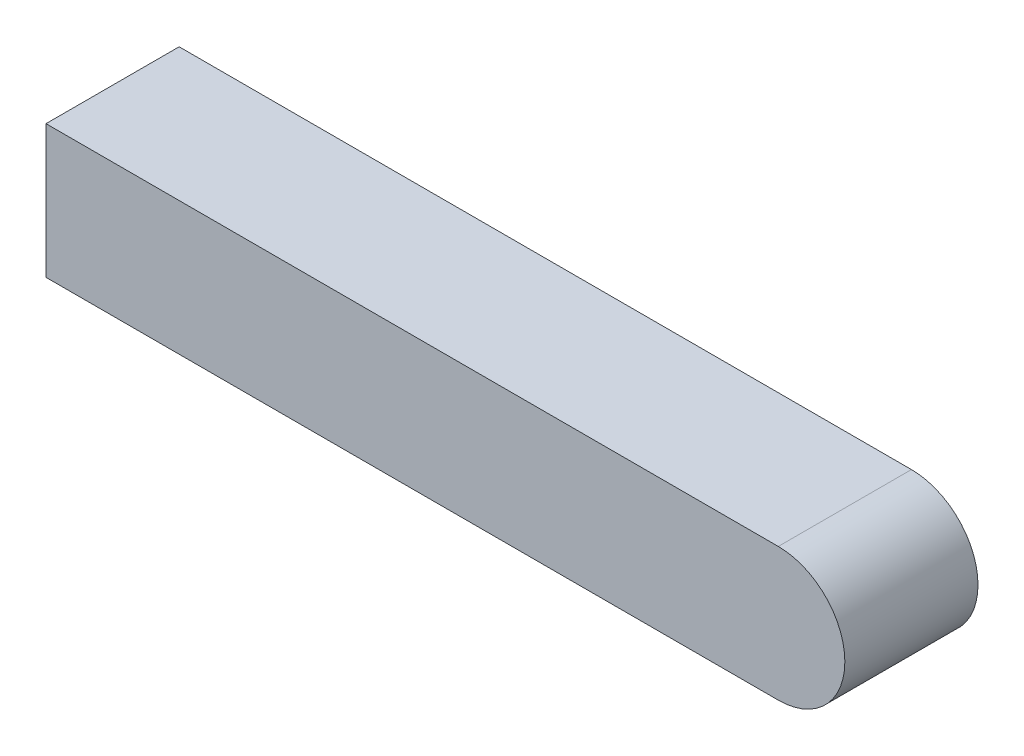
ISO-10303-21;
HEADER;
FILE_DESCRIPTION(('STEP AP214'),'2;1');
FILE_NAME('part.step','',(''),(''),'','','');
FILE_SCHEMA(('AUTOMOTIVE_DESIGN { 1 0 10303 214 1 1 1 1 }'));
ENDSEC;
DATA;
#1=APPLICATION_CONTEXT('core data for automotive mechanical design processes');
#2=APPLICATION_PROTOCOL_DEFINITION('international standard','automotive_design',2000,#1);
#3=PRODUCT_CONTEXT('',#1,'mechanical');
#4=PRODUCT('Part','Part','',(#3));
#5=PRODUCT_RELATED_PRODUCT_CATEGORY('part','',(#4));
#6=PRODUCT_DEFINITION_FORMATION('','',#4);
#7=PRODUCT_DEFINITION_CONTEXT('part definition',#1,'design');
#8=PRODUCT_DEFINITION('design','',#6,#7);
#9=PRODUCT_DEFINITION_SHAPE('','',#8);
#10=(LENGTH_UNIT() NAMED_UNIT(*) SI_UNIT(.MILLI.,.METRE.));
#11=(NAMED_UNIT(*) PLANE_ANGLE_UNIT() SI_UNIT($,.RADIAN.));
#12=(NAMED_UNIT(*) SI_UNIT($,.STERADIAN.) SOLID_ANGLE_UNIT());
#13=UNCERTAINTY_MEASURE_WITH_UNIT(LENGTH_MEASURE(1.E-05),#10,'distance_accuracy_value','');
#14=(GEOMETRIC_REPRESENTATION_CONTEXT(3) GLOBAL_UNCERTAINTY_ASSIGNED_CONTEXT((#13)) GLOBAL_UNIT_ASSIGNED_CONTEXT((#10,
#11,#12)) REPRESENTATION_CONTEXT('',''));
#15=CARTESIAN_POINT('',(0.,0.,0.));
#16=DIRECTION('',(0.,0.,1.));
#17=DIRECTION('',(1.,0.,0.));
#18=AXIS2_PLACEMENT_3D('',#15,#16,#17);
#19=CARTESIAN_POINT('',(-0.899999949336052,0.299999998882414,0.));
#20=DIRECTION('',(0.,0.,1.));
#21=DIRECTION('',(1.,0.,0.));
#22=AXIS2_PLACEMENT_3D('',#19,#20,#21);
#23=PLANE('',#22);
#24=DIRECTION('',(1.,0.,0.));
#25=VECTOR('',#24,1.);
#26=CARTESIAN_POINT('',(-0.899999949336052,0.199999999254942,0.));
#27=LINE('',#26,#25);
#28=CARTESIAN_POINT('',(-1.49999994710088,0.199999999254942,0.));
#29=VERTEX_POINT('',#28);
#30=CARTESIAN_POINT('',(-0.399999951571225,0.199999998882414,0.));
#31=VERTEX_POINT('',#30);
#32=EDGE_CURVE('E51',#29,#31,#27,.T.);
#33=ORIENTED_EDGE('',*,*,#32,.F.);
#34=DIRECTION('',(0.,1.,0.));
#35=VECTOR('',#34,1.);
#36=CARTESIAN_POINT('',(-1.49999994710088,0.299999998882414,0.));
#37=LINE('',#36,#35);
#38=CARTESIAN_POINT('',(-1.49999994710088,0.399999998509884,0.));
#39=VERTEX_POINT('',#38);
#40=EDGE_CURVE('E58',#39,#29,#37,.F.);
#41=ORIENTED_EDGE('',*,*,#40,.F.);
#42=DIRECTION('',(1.,0.,0.));
#43=VECTOR('',#42,1.);
#44=CARTESIAN_POINT('',(-0.899999949336052,0.399999998509884,0.));
#45=LINE('',#44,#43);
#46=CARTESIAN_POINT('',(-0.399999951571225,0.399999998509884,0.));
#47=VERTEX_POINT('',#46);
#48=EDGE_CURVE('E70',#47,#39,#45,.F.);
#49=ORIENTED_EDGE('',*,*,#48,.F.);
#50=CARTESIAN_POINT('',(-0.399999951571225,0.299999998509885,0.));
#51=DIRECTION('',(0.,0.,1.));
#52=DIRECTION('',(1.,0.,0.));
#53=AXIS2_PLACEMENT_3D('',#50,#51,#52);
#54=CIRCLE('',#53,0.0999999999999988);
#55=EDGE_CURVE('E20',#31,#47,#54,.T.);
#56=ORIENTED_EDGE('',*,*,#55,.F.);
#57=EDGE_LOOP('',(#33,#41,#49,#56));
#58=FACE_BOUND('',#57,.T.);
#59=ADVANCED_FACE('F17',(#58),#23,.F.);
#60=CARTESIAN_POINT('',(-0.899999949336052,0.399999998509884,0.));
#61=DIRECTION('',(0.,1.,0.));
#62=DIRECTION('',(0.,0.,1.));
#63=AXIS2_PLACEMENT_3D('',#60,#61,#62);
#64=PLANE('',#63);
#65=DIRECTION('',(0.,0.,1.));
#66=VECTOR('',#65,1.);
#67=CARTESIAN_POINT('',(-1.49999994710088,0.399999998509884,0.));
#68=LINE('',#67,#66);
#69=CARTESIAN_POINT('',(-1.49999994710088,0.399999998509884,0.2));
#70=VERTEX_POINT('',#69);
#71=EDGE_CURVE('E63',#70,#39,#68,.F.);
#72=ORIENTED_EDGE('',*,*,#71,.F.);
#73=DIRECTION('',(1.,0.,0.));
#74=VECTOR('',#73,1.);
#75=CARTESIAN_POINT('',(-0.899999949336052,0.399999998509884,0.2));
#76=LINE('',#75,#74);
#77=CARTESIAN_POINT('',(-0.399999951571225,0.399999998509884,0.2));
#78=VERTEX_POINT('',#77);
#79=EDGE_CURVE('E68',#78,#70,#76,.F.);
#80=ORIENTED_EDGE('',*,*,#79,.F.);
#81=DIRECTION('',(0.,0.,1.));
#82=VECTOR('',#81,1.);
#83=CARTESIAN_POINT('',(-0.399999951571225,0.399999998509884,0.));
#84=LINE('',#83,#82);
#85=EDGE_CURVE('E94',#78,#47,#84,.F.);
#86=ORIENTED_EDGE('',*,*,#85,.T.);
#87=ORIENTED_EDGE('',*,*,#48,.T.);
#88=EDGE_LOOP('',(#72,#80,#86,#87));
#89=FACE_BOUND('',#88,.T.);
#90=ADVANCED_FACE('F65',(#89),#64,.T.);
#91=CARTESIAN_POINT('',(-1.49999994710088,0.299999998882414,0.));
#92=DIRECTION('',(-1.,0.,0.));
#93=DIRECTION('',(0.,0.,1.));
#94=AXIS2_PLACEMENT_3D('',#91,#92,#93);
#95=PLANE('',#94);
#96=ORIENTED_EDGE('',*,*,#40,.T.);
#97=DIRECTION('',(0.,0.,-1.));
#98=VECTOR('',#97,1.);
#99=CARTESIAN_POINT('',(-1.49999994710088,0.199999999254942,0.));
#100=LINE('',#99,#98);
#101=CARTESIAN_POINT('',(-1.49999994710088,0.199999999254942,0.2));
#102=VERTEX_POINT('',#101);
#103=EDGE_CURVE('E74',#102,#29,#100,.T.);
#104=ORIENTED_EDGE('',*,*,#103,.F.);
#105=DIRECTION('',(0.,1.,0.));
#106=VECTOR('',#105,1.);
#107=CARTESIAN_POINT('',(-1.49999994710088,0.299999998882414,0.2));
#108=LINE('',#107,#106);
#109=EDGE_CURVE('E26',#70,#102,#108,.F.);
#110=ORIENTED_EDGE('',*,*,#109,.F.);
#111=ORIENTED_EDGE('',*,*,#71,.T.);
#112=EDGE_LOOP('',(#96,#104,#110,#111));
#113=FACE_BOUND('',#112,.T.);
#114=ADVANCED_FACE('F73',(#113),#95,.T.);
#115=CARTESIAN_POINT('',(-0.899999949336052,0.199999999254942,0.));
#116=DIRECTION('',(0.,-1.,0.));
#117=DIRECTION('',(0.,0.,-1.));
#118=AXIS2_PLACEMENT_3D('',#115,#116,#117);
#119=PLANE('',#118);
#120=ORIENTED_EDGE('',*,*,#103,.T.);
#121=ORIENTED_EDGE('',*,*,#32,.T.);
#122=DIRECTION('',(0.,0.,1.));
#123=VECTOR('',#122,1.);
#124=CARTESIAN_POINT('',(-0.399999951571225,0.199999998509886,0.));
#125=LINE('',#124,#123);
#126=CARTESIAN_POINT('',(-0.399999951571225,0.199999998882414,0.2));
#127=VERTEX_POINT('',#126);
#128=EDGE_CURVE('E85',#127,#31,#125,.F.);
#129=ORIENTED_EDGE('',*,*,#128,.F.);
#130=DIRECTION('',(1.,0.,0.));
#131=VECTOR('',#130,1.);
#132=CARTESIAN_POINT('',(-0.899999949336052,0.199999999254942,0.2));
#133=LINE('',#132,#131);
#134=EDGE_CURVE('E11',#102,#127,#133,.T.);
#135=ORIENTED_EDGE('',*,*,#134,.F.);
#136=EDGE_LOOP('',(#120,#121,#129,#135));
#137=FACE_BOUND('',#136,.T.);
#138=ADVANCED_FACE('F107',(#137),#119,.T.);
#139=CARTESIAN_POINT('',(-0.399999951571225,0.299999998509885,0.));
#140=DIRECTION('',(0.,0.,1.));
#141=DIRECTION('',(1.,0.,0.));
#142=AXIS2_PLACEMENT_3D('',#139,#140,#141);
#143=CYLINDRICAL_SURFACE('',#142,0.0999999999999988);
#144=ORIENTED_EDGE('',*,*,#128,.T.);
#145=ORIENTED_EDGE('',*,*,#55,.T.);
#146=ORIENTED_EDGE('',*,*,#85,.F.);
#147=CARTESIAN_POINT('',(-0.399999951571225,0.299999998509885,0.2));
#148=DIRECTION('',(0.,0.,1.));
#149=DIRECTION('',(1.,0.,0.));
#150=AXIS2_PLACEMENT_3D('',#147,#148,#149);
#151=CIRCLE('',#150,0.0999999999999988);
#152=EDGE_CURVE('E35',#127,#78,#151,.T.);
#153=ORIENTED_EDGE('',*,*,#152,.F.);
#154=EDGE_LOOP('',(#144,#145,#146,#153));
#155=FACE_BOUND('',#154,.T.);
#156=ADVANCED_FACE('F105',(#155),#143,.T.);
#157=CARTESIAN_POINT('',(-0.899999949336052,0.299999998882414,0.2));
#158=DIRECTION('',(0.,0.,1.));
#159=DIRECTION('',(1.,0.,0.));
#160=AXIS2_PLACEMENT_3D('',#157,#158,#159);
#161=PLANE('',#160);
#162=ORIENTED_EDGE('',*,*,#134,.T.);
#163=ORIENTED_EDGE('',*,*,#152,.T.);
#164=ORIENTED_EDGE('',*,*,#79,.T.);
#165=ORIENTED_EDGE('',*,*,#109,.T.);
#166=EDGE_LOOP('',(#162,#163,#164,#165));
#167=FACE_BOUND('',#166,.T.);
#168=ADVANCED_FACE('F78',(#167),#161,.T.);
#169=CLOSED_SHELL('',(#59,#90,#114,#138,#156,#168));
#170=MANIFOLD_SOLID_BREP('B1',#169);
#171=ADVANCED_BREP_SHAPE_REPRESENTATION('',(#18,#170),#14);
#172=SHAPE_DEFINITION_REPRESENTATION(#9,#171);
ENDSEC;
END-ISO-10303-21;
